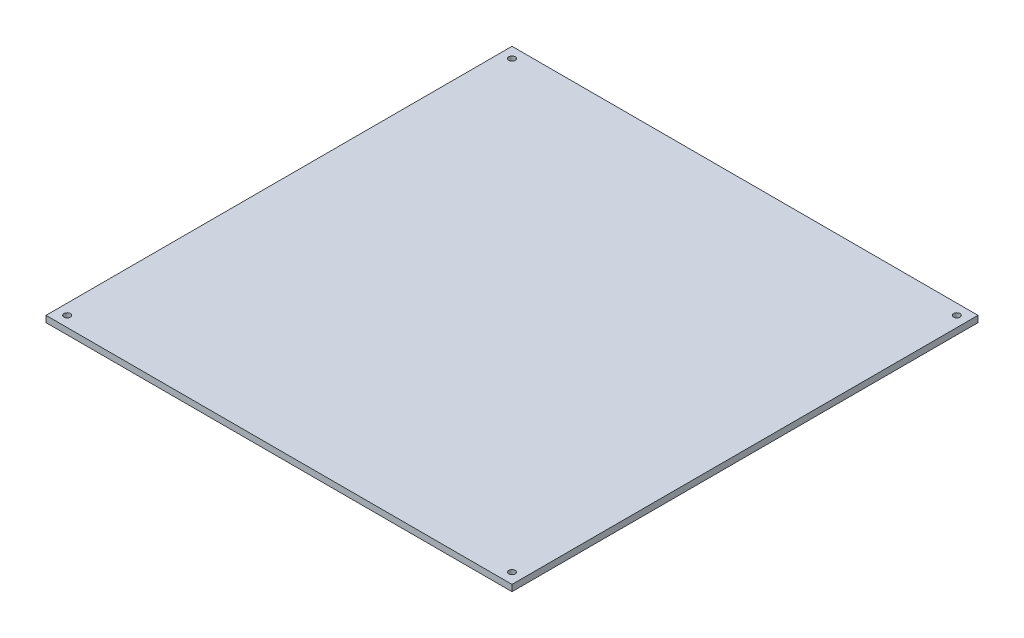
ISO-10303-21;
HEADER;
FILE_DESCRIPTION(('STEP AP214'),'2;1');
FILE_NAME('part.step','',(''),(''),'','','');
FILE_SCHEMA(('AUTOMOTIVE_DESIGN { 1 0 10303 214 1 1 1 1 }'));
ENDSEC;
DATA;
#1=APPLICATION_CONTEXT('core data for automotive mechanical design processes');
#2=APPLICATION_PROTOCOL_DEFINITION('international standard','automotive_design',2000,#1);
#3=PRODUCT_CONTEXT('',#1,'mechanical');
#4=PRODUCT('Part','Part','',(#3));
#5=PRODUCT_RELATED_PRODUCT_CATEGORY('part','',(#4));
#6=PRODUCT_DEFINITION_FORMATION('','',#4);
#7=PRODUCT_DEFINITION_CONTEXT('part definition',#1,'design');
#8=PRODUCT_DEFINITION('design','',#6,#7);
#9=PRODUCT_DEFINITION_SHAPE('','',#8);
#10=(LENGTH_UNIT() NAMED_UNIT(*) SI_UNIT(.MILLI.,.METRE.));
#11=(NAMED_UNIT(*) PLANE_ANGLE_UNIT() SI_UNIT($,.RADIAN.));
#12=(NAMED_UNIT(*) SI_UNIT($,.STERADIAN.) SOLID_ANGLE_UNIT());
#13=UNCERTAINTY_MEASURE_WITH_UNIT(LENGTH_MEASURE(1.E-05),#10,'distance_accuracy_value','');
#14=(GEOMETRIC_REPRESENTATION_CONTEXT(3) GLOBAL_UNCERTAINTY_ASSIGNED_CONTEXT((#13)) GLOBAL_UNIT_ASSIGNED_CONTEXT((#10,
#11,#12)) REPRESENTATION_CONTEXT('',''));
#15=CARTESIAN_POINT('',(0.,0.,0.));
#16=DIRECTION('',(0.,0.,1.));
#17=DIRECTION('',(1.,0.,0.));
#18=AXIS2_PLACEMENT_3D('',#15,#16,#17);
#19=CARTESIAN_POINT('',(0.,3.,0.));
#20=DIRECTION('',(0.,-1.,0.));
#21=DIRECTION('',(0.,0.,-1.));
#22=AXIS2_PLACEMENT_3D('',#19,#20,#21);
#23=PLANE('',#22);
#24=DIRECTION('',(0.,0.,-1.));
#25=VECTOR('',#24,1.);
#26=CARTESIAN_POINT('',(0.,3.,0.));
#27=LINE('',#26,#25);
#28=CARTESIAN_POINT('',(0.,3.,220.));
#29=VERTEX_POINT('',#28);
#30=CARTESIAN_POINT('',(0.,3.,0.));
#31=VERTEX_POINT('',#30);
#32=EDGE_CURVE('E88',#29,#31,#27,.T.);
#33=ORIENTED_EDGE('',*,*,#32,.T.);
#34=DIRECTION('',(-1.,0.,0.));
#35=VECTOR('',#34,1.);
#36=CARTESIAN_POINT('',(0.,3.,0.));
#37=LINE('',#36,#35);
#38=CARTESIAN_POINT('',(-220.,3.,0.));
#39=VERTEX_POINT('',#38);
#40=EDGE_CURVE('E83',#31,#39,#37,.T.);
#41=ORIENTED_EDGE('',*,*,#40,.T.);
#42=DIRECTION('',(0.,0.,1.));
#43=VECTOR('',#42,1.);
#44=CARTESIAN_POINT('',(-220.,3.,0.));
#45=LINE('',#44,#43);
#46=CARTESIAN_POINT('',(-220.,3.,220.));
#47=VERTEX_POINT('',#46);
#48=EDGE_CURVE('E86',#39,#47,#45,.T.);
#49=ORIENTED_EDGE('',*,*,#48,.T.);
#50=DIRECTION('',(1.,0.,0.));
#51=VECTOR('',#50,1.);
#52=CARTESIAN_POINT('',(0.,3.,220.));
#53=LINE('',#52,#51);
#54=EDGE_CURVE('E53',#47,#29,#53,.T.);
#55=ORIENTED_EDGE('',*,*,#54,.T.);
#56=EDGE_LOOP('',(#33,#41,#49,#55));
#57=FACE_BOUND('',#56,.T.);
#58=CARTESIAN_POINT('',(-5.00000000000003,3.,4.99999999999995));
#59=DIRECTION('',(0.,1.,0.));
#60=DIRECTION('',(0.,0.,1.));
#61=AXIS2_PLACEMENT_3D('',#58,#59,#60);
#62=CIRCLE('',#61,1.5);
#63=CARTESIAN_POINT('',(-5.00000000000003,3.,6.49999999999995));
#64=VERTEX_POINT('',#63);
#65=EDGE_CURVE('E103',#64,#64,#62,.T.);
#66=ORIENTED_EDGE('',*,*,#65,.F.);
#67=EDGE_LOOP('',(#66));
#68=FACE_BOUND('',#67,.T.);
#69=CARTESIAN_POINT('',(-5.00000000000001,3.,215.));
#70=DIRECTION('',(0.,1.,0.));
#71=DIRECTION('',(0.,0.,1.));
#72=AXIS2_PLACEMENT_3D('',#69,#70,#71);
#73=CIRCLE('',#72,1.5);
#74=CARTESIAN_POINT('',(-5.00000000000001,3.,216.5));
#75=VERTEX_POINT('',#74);
#76=EDGE_CURVE('E118',#75,#75,#73,.T.);
#77=ORIENTED_EDGE('',*,*,#76,.F.);
#78=EDGE_LOOP('',(#77));
#79=FACE_BOUND('',#78,.T.);
#80=CARTESIAN_POINT('',(-215.,3.,215.));
#81=DIRECTION('',(0.,1.,0.));
#82=DIRECTION('',(0.,0.,1.));
#83=AXIS2_PLACEMENT_3D('',#80,#81,#82);
#84=CIRCLE('',#83,1.5);
#85=CARTESIAN_POINT('',(-215.,3.,216.5));
#86=VERTEX_POINT('',#85);
#87=EDGE_CURVE('E124',#86,#86,#84,.T.);
#88=ORIENTED_EDGE('',*,*,#87,.F.);
#89=EDGE_LOOP('',(#88));
#90=FACE_BOUND('',#89,.T.);
#91=CARTESIAN_POINT('',(-215.,3.,5.00000000000001));
#92=DIRECTION('',(0.,1.,0.));
#93=DIRECTION('',(0.,0.,1.));
#94=AXIS2_PLACEMENT_3D('',#91,#92,#93);
#95=CIRCLE('',#94,1.5);
#96=CARTESIAN_POINT('',(-215.,3.,6.50000000000001));
#97=VERTEX_POINT('',#96);
#98=EDGE_CURVE('E130',#97,#97,#95,.T.);
#99=ORIENTED_EDGE('',*,*,#98,.F.);
#100=EDGE_LOOP('',(#99));
#101=FACE_BOUND('',#100,.T.);
#102=ADVANCED_FACE('F36',(#57,#68,#79,#90,#101),#23,.F.);
#103=CARTESIAN_POINT('',(0.,0.,0.));
#104=DIRECTION('',(0.,-1.,0.));
#105=DIRECTION('',(0.,0.,-1.));
#106=AXIS2_PLACEMENT_3D('',#103,#104,#105);
#107=PLANE('',#106);
#108=CARTESIAN_POINT('',(-215.,0.,215.));
#109=DIRECTION('',(0.,1.,0.));
#110=DIRECTION('',(0.,0.,1.));
#111=AXIS2_PLACEMENT_3D('',#108,#109,#110);
#112=CIRCLE('',#111,1.5);
#113=CARTESIAN_POINT('',(-215.,0.,216.5));
#114=VERTEX_POINT('',#113);
#115=EDGE_CURVE('E127',#114,#114,#112,.T.);
#116=ORIENTED_EDGE('',*,*,#115,.T.);
#117=EDGE_LOOP('',(#116));
#118=FACE_BOUND('',#117,.T.);
#119=CARTESIAN_POINT('',(-5.00000000000003,0.,4.99999999999995));
#120=DIRECTION('',(0.,1.,0.));
#121=DIRECTION('',(0.,0.,1.));
#122=AXIS2_PLACEMENT_3D('',#119,#120,#121);
#123=CIRCLE('',#122,1.5);
#124=CARTESIAN_POINT('',(-5.00000000000003,0.,6.49999999999995));
#125=VERTEX_POINT('',#124);
#126=EDGE_CURVE('E115',#125,#125,#123,.T.);
#127=ORIENTED_EDGE('',*,*,#126,.T.);
#128=EDGE_LOOP('',(#127));
#129=FACE_BOUND('',#128,.T.);
#130=DIRECTION('',(0.,0.,-1.));
#131=VECTOR('',#130,1.);
#132=CARTESIAN_POINT('',(0.,0.,0.));
#133=LINE('',#132,#131);
#134=CARTESIAN_POINT('',(0.,0.,220.));
#135=VERTEX_POINT('',#134);
#136=CARTESIAN_POINT('',(0.,0.,0.));
#137=VERTEX_POINT('',#136);
#138=EDGE_CURVE('E100',#135,#137,#133,.T.);
#139=ORIENTED_EDGE('',*,*,#138,.F.);
#140=DIRECTION('',(1.,0.,0.));
#141=VECTOR('',#140,1.);
#142=CARTESIAN_POINT('',(0.,0.,220.));
#143=LINE('',#142,#141);
#144=CARTESIAN_POINT('',(-220.,0.,220.));
#145=VERTEX_POINT('',#144);
#146=EDGE_CURVE('E76',#145,#135,#143,.T.);
#147=ORIENTED_EDGE('',*,*,#146,.F.);
#148=DIRECTION('',(0.,0.,1.));
#149=VECTOR('',#148,1.);
#150=CARTESIAN_POINT('',(-220.,0.,0.));
#151=LINE('',#150,#149);
#152=CARTESIAN_POINT('',(-220.,0.,0.));
#153=VERTEX_POINT('',#152);
#154=EDGE_CURVE('E70',#153,#145,#151,.T.);
#155=ORIENTED_EDGE('',*,*,#154,.F.);
#156=DIRECTION('',(-1.,0.,0.));
#157=VECTOR('',#156,1.);
#158=CARTESIAN_POINT('',(0.,0.,0.));
#159=LINE('',#158,#157);
#160=EDGE_CURVE('E92',#137,#153,#159,.T.);
#161=ORIENTED_EDGE('',*,*,#160,.F.);
#162=EDGE_LOOP('',(#139,#147,#155,#161));
#163=FACE_BOUND('',#162,.T.);
#164=CARTESIAN_POINT('',(-5.00000000000001,0.,215.));
#165=DIRECTION('',(0.,1.,0.));
#166=DIRECTION('',(0.,0.,1.));
#167=AXIS2_PLACEMENT_3D('',#164,#165,#166);
#168=CIRCLE('',#167,1.5);
#169=CARTESIAN_POINT('',(-5.00000000000001,0.,216.5));
#170=VERTEX_POINT('',#169);
#171=EDGE_CURVE('E121',#170,#170,#168,.T.);
#172=ORIENTED_EDGE('',*,*,#171,.T.);
#173=EDGE_LOOP('',(#172));
#174=FACE_BOUND('',#173,.T.);
#175=CARTESIAN_POINT('',(-215.,0.,5.00000000000001));
#176=DIRECTION('',(0.,1.,0.));
#177=DIRECTION('',(0.,0.,1.));
#178=AXIS2_PLACEMENT_3D('',#175,#176,#177);
#179=CIRCLE('',#178,1.5);
#180=CARTESIAN_POINT('',(-215.,0.,6.50000000000001));
#181=VERTEX_POINT('',#180);
#182=EDGE_CURVE('E133',#181,#181,#179,.T.);
#183=ORIENTED_EDGE('',*,*,#182,.T.);
#184=EDGE_LOOP('',(#183));
#185=FACE_BOUND('',#184,.T.);
#186=ADVANCED_FACE('F111',(#118,#129,#163,#174,#185),#107,.T.);
#187=CARTESIAN_POINT('',(0.,3.,0.));
#188=DIRECTION('',(-1.,0.,0.));
#189=DIRECTION('',(0.,0.,1.));
#190=AXIS2_PLACEMENT_3D('',#187,#188,#189);
#191=PLANE('',#190);
#192=ORIENTED_EDGE('',*,*,#138,.T.);
#193=DIRECTION('',(0.,-1.,0.));
#194=VECTOR('',#193,1.);
#195=CARTESIAN_POINT('',(0.,3.,0.));
#196=LINE('',#195,#194);
#197=EDGE_CURVE('E11',#31,#137,#196,.T.);
#198=ORIENTED_EDGE('',*,*,#197,.F.);
#199=ORIENTED_EDGE('',*,*,#32,.F.);
#200=DIRECTION('',(0.,-1.,0.));
#201=VECTOR('',#200,1.);
#202=CARTESIAN_POINT('',(0.,3.,220.));
#203=LINE('',#202,#201);
#204=EDGE_CURVE('E96',#29,#135,#203,.T.);
#205=ORIENTED_EDGE('',*,*,#204,.T.);
#206=EDGE_LOOP('',(#192,#198,#199,#205));
#207=FACE_BOUND('',#206,.T.);
#208=ADVANCED_FACE('F38',(#207),#191,.F.);
#209=CARTESIAN_POINT('',(0.,3.,0.));
#210=DIRECTION('',(0.,0.,1.));
#211=DIRECTION('',(1.,0.,0.));
#212=AXIS2_PLACEMENT_3D('',#209,#210,#211);
#213=PLANE('',#212);
#214=ORIENTED_EDGE('',*,*,#160,.T.);
#215=DIRECTION('',(0.,-1.,0.));
#216=VECTOR('',#215,1.);
#217=CARTESIAN_POINT('',(-220.,3.,0.));
#218=LINE('',#217,#216);
#219=EDGE_CURVE('E45',#39,#153,#218,.T.);
#220=ORIENTED_EDGE('',*,*,#219,.F.);
#221=ORIENTED_EDGE('',*,*,#40,.F.);
#222=ORIENTED_EDGE('',*,*,#197,.T.);
#223=EDGE_LOOP('',(#214,#220,#221,#222));
#224=FACE_BOUND('',#223,.T.);
#225=ADVANCED_FACE('F91',(#224),#213,.F.);
#226=CARTESIAN_POINT('',(-220.,3.,0.));
#227=DIRECTION('',(1.,0.,0.));
#228=DIRECTION('',(0.,0.,-1.));
#229=AXIS2_PLACEMENT_3D('',#226,#227,#228);
#230=PLANE('',#229);
#231=ORIENTED_EDGE('',*,*,#154,.T.);
#232=DIRECTION('',(0.,-1.,0.));
#233=VECTOR('',#232,1.);
#234=CARTESIAN_POINT('',(-220.,3.,220.));
#235=LINE('',#234,#233);
#236=EDGE_CURVE('E93',#47,#145,#235,.T.);
#237=ORIENTED_EDGE('',*,*,#236,.F.);
#238=ORIENTED_EDGE('',*,*,#48,.F.);
#239=ORIENTED_EDGE('',*,*,#219,.T.);
#240=EDGE_LOOP('',(#231,#237,#238,#239));
#241=FACE_BOUND('',#240,.T.);
#242=ADVANCED_FACE('F94',(#241),#230,.F.);
#243=CARTESIAN_POINT('',(0.,3.,220.));
#244=DIRECTION('',(0.,0.,-1.));
#245=DIRECTION('',(-1.,0.,0.));
#246=AXIS2_PLACEMENT_3D('',#243,#244,#245);
#247=PLANE('',#246);
#248=ORIENTED_EDGE('',*,*,#146,.T.);
#249=ORIENTED_EDGE('',*,*,#204,.F.);
#250=ORIENTED_EDGE('',*,*,#54,.F.);
#251=ORIENTED_EDGE('',*,*,#236,.T.);
#252=EDGE_LOOP('',(#248,#249,#250,#251));
#253=FACE_BOUND('',#252,.T.);
#254=ADVANCED_FACE('F108',(#253),#247,.F.);
#255=CARTESIAN_POINT('',(-5.00000000000003,3.,4.99999999999995));
#256=DIRECTION('',(0.,-1.,0.));
#257=DIRECTION('',(0.,0.,-1.));
#258=AXIS2_PLACEMENT_3D('',#255,#256,#257);
#259=CYLINDRICAL_SURFACE('',#258,1.5);
#260=ORIENTED_EDGE('',*,*,#65,.T.);
#261=EDGE_LOOP('',(#260));
#262=FACE_BOUND('',#261,.T.);
#263=ORIENTED_EDGE('',*,*,#126,.F.);
#264=EDGE_LOOP('',(#263));
#265=FACE_BOUND('',#264,.T.);
#266=ADVANCED_FACE('F150',(#262,#265),#259,.F.);
#267=CARTESIAN_POINT('',(-5.00000000000001,3.,215.));
#268=DIRECTION('',(0.,-1.,0.));
#269=DIRECTION('',(0.,0.,-1.));
#270=AXIS2_PLACEMENT_3D('',#267,#268,#269);
#271=CYLINDRICAL_SURFACE('',#270,1.5);
#272=ORIENTED_EDGE('',*,*,#76,.T.);
#273=EDGE_LOOP('',(#272));
#274=FACE_BOUND('',#273,.T.);
#275=ORIENTED_EDGE('',*,*,#171,.F.);
#276=EDGE_LOOP('',(#275));
#277=FACE_BOUND('',#276,.T.);
#278=ADVANCED_FACE('F196',(#274,#277),#271,.F.);
#279=CARTESIAN_POINT('',(-215.,3.,215.));
#280=DIRECTION('',(0.,-1.,0.));
#281=DIRECTION('',(0.,0.,-1.));
#282=AXIS2_PLACEMENT_3D('',#279,#280,#281);
#283=CYLINDRICAL_SURFACE('',#282,1.5);
#284=ORIENTED_EDGE('',*,*,#87,.T.);
#285=EDGE_LOOP('',(#284));
#286=FACE_BOUND('',#285,.T.);
#287=ORIENTED_EDGE('',*,*,#115,.F.);
#288=EDGE_LOOP('',(#287));
#289=FACE_BOUND('',#288,.T.);
#290=ADVANCED_FACE('F204',(#286,#289),#283,.F.);
#291=CARTESIAN_POINT('',(-215.,3.,5.00000000000001));
#292=DIRECTION('',(0.,-1.,0.));
#293=DIRECTION('',(0.,0.,-1.));
#294=AXIS2_PLACEMENT_3D('',#291,#292,#293);
#295=CYLINDRICAL_SURFACE('',#294,1.5);
#296=ORIENTED_EDGE('',*,*,#98,.T.);
#297=EDGE_LOOP('',(#296));
#298=FACE_BOUND('',#297,.T.);
#299=ORIENTED_EDGE('',*,*,#182,.F.);
#300=EDGE_LOOP('',(#299));
#301=FACE_BOUND('',#300,.T.);
#302=ADVANCED_FACE('F139',(#298,#301),#295,.F.);
#303=CLOSED_SHELL('',(#102,#186,#208,#225,#242,#254,#266,#278,#290,#302));
#304=MANIFOLD_SOLID_BREP('B2',#303);
#305=ADVANCED_BREP_SHAPE_REPRESENTATION('',(#18,#304),#14);
#306=SHAPE_DEFINITION_REPRESENTATION(#9,#305);
ENDSEC;
END-ISO-10303-21;
